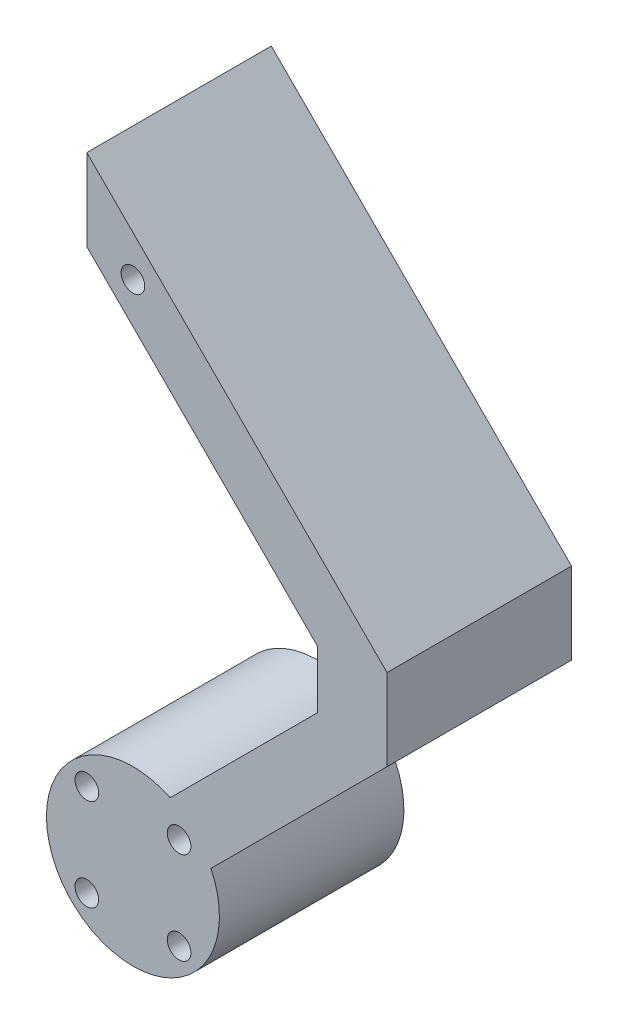
ISO-10303-21;
HEADER;
FILE_DESCRIPTION(('STEP AP214'),'2;1');
FILE_NAME('part.step','',(''),(''),'','','');
FILE_SCHEMA(('AUTOMOTIVE_DESIGN { 1 0 10303 214 1 1 1 1 }'));
ENDSEC;
DATA;
#1=APPLICATION_CONTEXT('core data for automotive mechanical design processes');
#2=APPLICATION_PROTOCOL_DEFINITION('international standard','automotive_design',2000,#1);
#3=PRODUCT_CONTEXT('',#1,'mechanical');
#4=PRODUCT('Part','Part','',(#3));
#5=PRODUCT_RELATED_PRODUCT_CATEGORY('part','',(#4));
#6=PRODUCT_DEFINITION_FORMATION('','',#4);
#7=PRODUCT_DEFINITION_CONTEXT('part definition',#1,'design');
#8=PRODUCT_DEFINITION('design','',#6,#7);
#9=PRODUCT_DEFINITION_SHAPE('','',#8);
#10=(LENGTH_UNIT() NAMED_UNIT(*) SI_UNIT(.MILLI.,.METRE.));
#11=(NAMED_UNIT(*) PLANE_ANGLE_UNIT() SI_UNIT($,.RADIAN.));
#12=(NAMED_UNIT(*) SI_UNIT($,.STERADIAN.) SOLID_ANGLE_UNIT());
#13=UNCERTAINTY_MEASURE_WITH_UNIT(LENGTH_MEASURE(1.E-05),#10,'distance_accuracy_value','');
#14=(GEOMETRIC_REPRESENTATION_CONTEXT(3) GLOBAL_UNCERTAINTY_ASSIGNED_CONTEXT((#13)) GLOBAL_UNIT_ASSIGNED_CONTEXT((#10,
#11,#12)) REPRESENTATION_CONTEXT('',''));
#15=CARTESIAN_POINT('',(0.,0.,0.));
#16=DIRECTION('',(0.,0.,1.));
#17=DIRECTION('',(1.,0.,0.));
#18=AXIS2_PLACEMENT_3D('',#15,#16,#17);
#19=CARTESIAN_POINT('',(22.5000000000002,-22.5,32.));
#20=DIRECTION('',(0.70710678118655,-0.707106781186545,0.));
#21=DIRECTION('',(0.707106781186545,0.70710678118655,0.));
#22=AXIS2_PLACEMENT_3D('',#19,#20,#21);
#23=PLANE('',#22);
#24=DIRECTION('',(-0.707106781186545,-0.70710678118655,0.));
#25=VECTOR('',#24,1.);
#26=CARTESIAN_POINT('',(22.5000000000002,-22.5,0.));
#27=LINE('',#26,#25);
#28=CARTESIAN_POINT('',(40.,-5.,0.));
#29=VERTEX_POINT('',#28);
#30=CARTESIAN_POINT('',(14.4644660940675,-30.5355339059327,0.));
#31=VERTEX_POINT('',#30);
#32=EDGE_CURVE('E146',#29,#31,#27,.T.);
#33=ORIENTED_EDGE('',*,*,#32,.T.);
#34=DIRECTION('',(0.,0.,-1.));
#35=VECTOR('',#34,1.);
#36=CARTESIAN_POINT('',(14.4644660940675,-30.5355339059327,32.));
#37=LINE('',#36,#35);
#38=CARTESIAN_POINT('',(14.4644660940675,-30.5355339059327,32.));
#39=VERTEX_POINT('',#38);
#40=EDGE_CURVE('E11',#39,#31,#37,.T.);
#41=ORIENTED_EDGE('',*,*,#40,.F.);
#42=DIRECTION('',(-0.707106781186545,-0.70710678118655,0.));
#43=VECTOR('',#42,1.);
#44=CARTESIAN_POINT('',(22.5000000000002,-22.5,32.));
#45=LINE('',#44,#43);
#46=CARTESIAN_POINT('',(40.,-5.,32.));
#47=VERTEX_POINT('',#46);
#48=EDGE_CURVE('E189',#47,#39,#45,.T.);
#49=ORIENTED_EDGE('',*,*,#48,.F.);
#50=DIRECTION('',(0.,0.,-1.));
#51=VECTOR('',#50,1.);
#52=CARTESIAN_POINT('',(40.,-5.,32.));
#53=LINE('',#52,#51);
#54=EDGE_CURVE('E127',#47,#29,#53,.T.);
#55=ORIENTED_EDGE('',*,*,#54,.T.);
#56=EDGE_LOOP('',(#33,#41,#49,#55));
#57=FACE_BOUND('',#56,.T.);
#58=ADVANCED_FACE('F33',(#57),#23,.F.);
#59=CARTESIAN_POINT('',(8.,-44.0710678118655,32.));
#60=DIRECTION('',(0.,0.,-1.));
#61=DIRECTION('',(-1.,0.,0.));
#62=AXIS2_PLACEMENT_3D('',#59,#60,#61);
#63=CYLINDRICAL_SURFACE('',#62,15.0000000000002);
#64=CARTESIAN_POINT('',(8.,-44.0710678118655,0.));
#65=DIRECTION('',(0.,0.,1.));
#66=DIRECTION('',(1.,0.,0.));
#67=AXIS2_PLACEMENT_3D('',#64,#65,#66);
#68=CIRCLE('',#67,15.0000000000002);
#69=CARTESIAN_POINT('',(21.535533905933,-37.6066017177982,0.));
#70=VERTEX_POINT('',#69);
#71=EDGE_CURVE('E149',#31,#70,#68,.T.);
#72=ORIENTED_EDGE('',*,*,#71,.T.);
#73=DIRECTION('',(0.,0.,-1.));
#74=VECTOR('',#73,1.);
#75=CARTESIAN_POINT('',(21.535533905933,-37.6066017177982,32.));
#76=LINE('',#75,#74);
#77=CARTESIAN_POINT('',(21.535533905933,-37.6066017177982,32.));
#78=VERTEX_POINT('',#77);
#79=EDGE_CURVE('E42',#78,#70,#76,.T.);
#80=ORIENTED_EDGE('',*,*,#79,.F.);
#81=CARTESIAN_POINT('',(8.,-44.0710678118655,32.));
#82=DIRECTION('',(0.,0.,1.));
#83=DIRECTION('',(1.,0.,0.));
#84=AXIS2_PLACEMENT_3D('',#81,#82,#83);
#85=CIRCLE('',#84,15.0000000000002);
#86=EDGE_CURVE('E93',#39,#78,#85,.T.);
#87=ORIENTED_EDGE('',*,*,#86,.F.);
#88=ORIENTED_EDGE('',*,*,#40,.T.);
#89=EDGE_LOOP('',(#72,#80,#87,#88));
#90=FACE_BOUND('',#89,.T.);
#91=ADVANCED_FACE('F235',(#90),#63,.T.);
#92=CARTESIAN_POINT('',(29.5710678118657,-29.5710678118654,32.));
#93=DIRECTION('',(-0.70710678118655,0.707106781186545,0.));
#94=DIRECTION('',(-0.707106781186545,-0.70710678118655,0.));
#95=AXIS2_PLACEMENT_3D('',#92,#93,#94);
#96=PLANE('',#95);
#97=DIRECTION('',(0.707106781186545,0.70710678118655,0.));
#98=VECTOR('',#97,1.);
#99=CARTESIAN_POINT('',(29.5710678118657,-29.5710678118654,0.));
#100=LINE('',#99,#98);
#101=CARTESIAN_POINT('',(52.0710678118655,-7.07106781186546,0.));
#102=VERTEX_POINT('',#101);
#103=EDGE_CURVE('E151',#70,#102,#100,.T.);
#104=ORIENTED_EDGE('',*,*,#103,.T.);
#105=DIRECTION('',(0.,0.,-1.));
#106=VECTOR('',#105,1.);
#107=CARTESIAN_POINT('',(52.0710678118655,-7.07106781186546,32.));
#108=LINE('',#107,#106);
#109=CARTESIAN_POINT('',(52.0710678118655,-7.07106781186546,32.));
#110=VERTEX_POINT('',#109);
#111=EDGE_CURVE('E168',#110,#102,#108,.T.);
#112=ORIENTED_EDGE('',*,*,#111,.F.);
#113=DIRECTION('',(0.707106781186545,0.70710678118655,0.));
#114=VECTOR('',#113,1.);
#115=CARTESIAN_POINT('',(29.5710678118657,-29.5710678118654,32.));
#116=LINE('',#115,#114);
#117=EDGE_CURVE('E175',#78,#110,#116,.T.);
#118=ORIENTED_EDGE('',*,*,#117,.F.);
#119=ORIENTED_EDGE('',*,*,#79,.T.);
#120=EDGE_LOOP('',(#104,#112,#118,#119));
#121=FACE_BOUND('',#120,.T.);
#122=ADVANCED_FACE('F173',(#121),#96,.F.);
#123=CARTESIAN_POINT('',(52.0710678118655,-1.53293232913166E-13,32.));
#124=DIRECTION('',(1.,0.,0.));
#125=DIRECTION('',(0.,1.,0.));
#126=AXIS2_PLACEMENT_3D('',#123,#124,#125);
#127=PLANE('',#126);
#128=DIRECTION('',(0.,-1.,0.));
#129=VECTOR('',#128,1.);
#130=CARTESIAN_POINT('',(52.0710678118655,-1.53293232913166E-13,0.));
#131=LINE('',#130,#129);
#132=CARTESIAN_POINT('',(52.0710678118655,7.07106781186545,0.));
#133=VERTEX_POINT('',#132);
#134=EDGE_CURVE('E154',#133,#102,#131,.T.);
#135=ORIENTED_EDGE('',*,*,#134,.F.);
#136=DIRECTION('',(0.,0.,-1.));
#137=VECTOR('',#136,1.);
#138=CARTESIAN_POINT('',(52.0710678118655,7.07106781186545,32.));
#139=LINE('',#138,#137);
#140=CARTESIAN_POINT('',(52.0710678118655,7.07106781186545,32.));
#141=VERTEX_POINT('',#140);
#142=EDGE_CURVE('E166',#141,#133,#139,.T.);
#143=ORIENTED_EDGE('',*,*,#142,.F.);
#144=DIRECTION('',(0.,-1.,0.));
#145=VECTOR('',#144,1.);
#146=CARTESIAN_POINT('',(52.0710678118655,-1.53293232913166E-13,32.));
#147=LINE('',#146,#145);
#148=EDGE_CURVE('E184',#141,#110,#147,.T.);
#149=ORIENTED_EDGE('',*,*,#148,.T.);
#150=ORIENTED_EDGE('',*,*,#111,.T.);
#151=EDGE_LOOP('',(#135,#143,#149,#150));
#152=FACE_BOUND('',#151,.T.);
#153=ADVANCED_FACE('F182',(#152),#127,.T.);
#154=CARTESIAN_POINT('',(29.5710678118656,29.5710678118655,32.));
#155=DIRECTION('',(-0.707106781186549,-0.707106781186546,0.));
#156=DIRECTION('',(0.707106781186546,-0.707106781186549,0.));
#157=AXIS2_PLACEMENT_3D('',#154,#155,#156);
#158=PLANE('',#157);
#159=DIRECTION('',(-0.707106781186546,0.707106781186549,0.));
#160=VECTOR('',#159,1.);
#161=CARTESIAN_POINT('',(29.5710678118656,29.5710678118655,0.));
#162=LINE('',#161,#160);
#163=CARTESIAN_POINT('',(0.,59.1421356237311,0.));
#164=VERTEX_POINT('',#163);
#165=EDGE_CURVE('E157',#133,#164,#162,.T.);
#166=ORIENTED_EDGE('',*,*,#165,.T.);
#167=DIRECTION('',(0.,0.,-1.));
#168=VECTOR('',#167,1.);
#169=CARTESIAN_POINT('',(0.,59.1421356237311,32.));
#170=LINE('',#169,#168);
#171=CARTESIAN_POINT('',(0.,59.1421356237311,32.));
#172=VERTEX_POINT('',#171);
#173=EDGE_CURVE('E122',#172,#164,#170,.T.);
#174=ORIENTED_EDGE('',*,*,#173,.F.);
#175=DIRECTION('',(-0.707106781186546,0.707106781186549,0.));
#176=VECTOR('',#175,1.);
#177=CARTESIAN_POINT('',(29.5710678118656,29.5710678118655,32.));
#178=LINE('',#177,#176);
#179=EDGE_CURVE('E113',#141,#172,#178,.T.);
#180=ORIENTED_EDGE('',*,*,#179,.F.);
#181=ORIENTED_EDGE('',*,*,#142,.T.);
#182=EDGE_LOOP('',(#166,#174,#180,#181));
#183=FACE_BOUND('',#182,.T.);
#184=ADVANCED_FACE('F274',(#183),#158,.F.);
#185=CARTESIAN_POINT('',(0.,0.,32.));
#186=DIRECTION('',(1.,0.,0.));
#187=DIRECTION('',(0.,1.,0.));
#188=AXIS2_PLACEMENT_3D('',#185,#186,#187);
#189=PLANE('',#188);
#190=DIRECTION('',(0.,-1.,0.));
#191=VECTOR('',#190,1.);
#192=CARTESIAN_POINT('',(0.,0.,0.));
#193=LINE('',#192,#191);
#194=CARTESIAN_POINT('',(0.,45.0000000000002,0.));
#195=VERTEX_POINT('',#194);
#196=EDGE_CURVE('E121',#164,#195,#193,.T.);
#197=ORIENTED_EDGE('',*,*,#196,.T.);
#198=DIRECTION('',(0.,0.,-1.));
#199=VECTOR('',#198,1.);
#200=CARTESIAN_POINT('',(0.,45.0000000000002,32.));
#201=LINE('',#200,#199);
#202=CARTESIAN_POINT('',(0.,45.0000000000002,32.));
#203=VERTEX_POINT('',#202);
#204=EDGE_CURVE('E118',#203,#195,#201,.T.);
#205=ORIENTED_EDGE('',*,*,#204,.F.);
#206=DIRECTION('',(0.,-1.,0.));
#207=VECTOR('',#206,1.);
#208=CARTESIAN_POINT('',(0.,0.,32.));
#209=LINE('',#208,#207);
#210=EDGE_CURVE('E106',#172,#203,#209,.T.);
#211=ORIENTED_EDGE('',*,*,#210,.F.);
#212=ORIENTED_EDGE('',*,*,#173,.T.);
#213=EDGE_LOOP('',(#197,#205,#211,#212));
#214=FACE_BOUND('',#213,.T.);
#215=ADVANCED_FACE('F119',(#214),#189,.F.);
#216=CARTESIAN_POINT('',(22.5000000000001,22.5,32.));
#217=DIRECTION('',(0.707106781186549,0.707106781186546,0.));
#218=DIRECTION('',(-0.707106781186546,0.707106781186549,0.));
#219=AXIS2_PLACEMENT_3D('',#216,#217,#218);
#220=PLANE('',#219);
#221=DIRECTION('',(0.707106781186546,-0.707106781186549,0.));
#222=VECTOR('',#221,1.);
#223=CARTESIAN_POINT('',(22.5000000000001,22.5,0.));
#224=LINE('',#223,#222);
#225=CARTESIAN_POINT('',(40.,5.,0.));
#226=VERTEX_POINT('',#225);
#227=EDGE_CURVE('E79',#195,#226,#224,.T.);
#228=ORIENTED_EDGE('',*,*,#227,.T.);
#229=DIRECTION('',(0.,0.,-1.));
#230=VECTOR('',#229,1.);
#231=CARTESIAN_POINT('',(40.,5.,32.));
#232=LINE('',#231,#230);
#233=CARTESIAN_POINT('',(40.,5.,32.));
#234=VERTEX_POINT('',#233);
#235=EDGE_CURVE('E123',#234,#226,#232,.T.);
#236=ORIENTED_EDGE('',*,*,#235,.F.);
#237=DIRECTION('',(0.707106781186546,-0.707106781186549,0.));
#238=VECTOR('',#237,1.);
#239=CARTESIAN_POINT('',(22.5000000000001,22.5,32.));
#240=LINE('',#239,#238);
#241=EDGE_CURVE('E110',#203,#234,#240,.T.);
#242=ORIENTED_EDGE('',*,*,#241,.F.);
#243=ORIENTED_EDGE('',*,*,#204,.T.);
#244=EDGE_LOOP('',(#228,#236,#242,#243));
#245=FACE_BOUND('',#244,.T.);
#246=ADVANCED_FACE('F125',(#245),#220,.F.);
#247=CARTESIAN_POINT('',(8.,44.0710678118655,32.));
#248=DIRECTION('',(0.,0.,-1.));
#249=DIRECTION('',(-1.,0.,0.));
#250=AXIS2_PLACEMENT_3D('',#247,#248,#249);
#251=CYLINDRICAL_SURFACE('',#250,2.05000000000001);
#252=CARTESIAN_POINT('',(8.,44.0710678118655,32.));
#253=DIRECTION('',(0.,0.,1.));
#254=DIRECTION('',(1.,0.,0.));
#255=AXIS2_PLACEMENT_3D('',#252,#253,#254);
#256=CIRCLE('',#255,2.05000000000001);
#257=CARTESIAN_POINT('',(10.05,44.0710678118655,32.));
#258=VERTEX_POINT('',#257);
#259=EDGE_CURVE('E191',#258,#258,#256,.T.);
#260=ORIENTED_EDGE('',*,*,#259,.T.);
#261=EDGE_LOOP('',(#260));
#262=FACE_BOUND('',#261,.T.);
#263=CARTESIAN_POINT('',(8.,44.0710678118655,0.));
#264=DIRECTION('',(0.,0.,1.));
#265=DIRECTION('',(1.,0.,0.));
#266=AXIS2_PLACEMENT_3D('',#263,#264,#265);
#267=CIRCLE('',#266,2.05000000000001);
#268=CARTESIAN_POINT('',(10.05,44.0710678118655,0.));
#269=VERTEX_POINT('',#268);
#270=EDGE_CURVE('E143',#269,#269,#267,.T.);
#271=ORIENTED_EDGE('',*,*,#270,.F.);
#272=EDGE_LOOP('',(#271));
#273=FACE_BOUND('',#272,.T.);
#274=ADVANCED_FACE('F220',(#262,#273),#251,.F.);
#275=CARTESIAN_POINT('',(1.6306400674182E-13,-36.0710678118654,32.));
#276=DIRECTION('',(0.,0.,-1.));
#277=DIRECTION('',(-1.,0.,0.));
#278=AXIS2_PLACEMENT_3D('',#275,#276,#277);
#279=CYLINDRICAL_SURFACE('',#278,2.05);
#280=CARTESIAN_POINT('',(1.6306400674182E-13,-36.0710678118654,32.));
#281=DIRECTION('',(0.,0.,1.));
#282=DIRECTION('',(1.,0.,0.));
#283=AXIS2_PLACEMENT_3D('',#280,#281,#282);
#284=CIRCLE('',#283,2.05);
#285=CARTESIAN_POINT('',(2.05000000000016,-36.0710678118654,32.));
#286=VERTEX_POINT('',#285);
#287=EDGE_CURVE('E194',#286,#286,#284,.T.);
#288=ORIENTED_EDGE('',*,*,#287,.T.);
#289=EDGE_LOOP('',(#288));
#290=FACE_BOUND('',#289,.T.);
#291=CARTESIAN_POINT('',(1.6306400674182E-13,-36.0710678118654,0.));
#292=DIRECTION('',(0.,0.,1.));
#293=DIRECTION('',(1.,0.,0.));
#294=AXIS2_PLACEMENT_3D('',#291,#292,#293);
#295=CIRCLE('',#294,2.05);
#296=CARTESIAN_POINT('',(2.05000000000016,-36.0710678118654,0.));
#297=VERTEX_POINT('',#296);
#298=EDGE_CURVE('E140',#297,#297,#295,.T.);
#299=ORIENTED_EDGE('',*,*,#298,.F.);
#300=EDGE_LOOP('',(#299));
#301=FACE_BOUND('',#300,.T.);
#302=ADVANCED_FACE('F223',(#290,#301),#279,.F.);
#303=CARTESIAN_POINT('',(16.0000000000002,-36.0710678118654,32.));
#304=DIRECTION('',(0.,0.,-1.));
#305=DIRECTION('',(-1.,0.,0.));
#306=AXIS2_PLACEMENT_3D('',#303,#304,#305);
#307=CYLINDRICAL_SURFACE('',#306,2.05);
#308=CARTESIAN_POINT('',(16.0000000000002,-36.0710678118654,32.));
#309=DIRECTION('',(0.,0.,1.));
#310=DIRECTION('',(1.,0.,0.));
#311=AXIS2_PLACEMENT_3D('',#308,#309,#310);
#312=CIRCLE('',#311,2.05);
#313=CARTESIAN_POINT('',(18.0500000000002,-36.0710678118654,32.));
#314=VERTEX_POINT('',#313);
#315=EDGE_CURVE('E197',#314,#314,#312,.T.);
#316=ORIENTED_EDGE('',*,*,#315,.T.);
#317=EDGE_LOOP('',(#316));
#318=FACE_BOUND('',#317,.T.);
#319=CARTESIAN_POINT('',(16.0000000000002,-36.0710678118654,0.));
#320=DIRECTION('',(0.,0.,1.));
#321=DIRECTION('',(1.,0.,0.));
#322=AXIS2_PLACEMENT_3D('',#319,#320,#321);
#323=CIRCLE('',#322,2.05);
#324=CARTESIAN_POINT('',(18.0500000000002,-36.0710678118654,0.));
#325=VERTEX_POINT('',#324);
#326=EDGE_CURVE('E137',#325,#325,#323,.T.);
#327=ORIENTED_EDGE('',*,*,#326,.F.);
#328=EDGE_LOOP('',(#327));
#329=FACE_BOUND('',#328,.T.);
#330=ADVANCED_FACE('F246',(#318,#329),#307,.F.);
#331=CARTESIAN_POINT('',(16.0000000000002,-52.0710678118654,32.));
#332=DIRECTION('',(0.,0.,-1.));
#333=DIRECTION('',(-1.,0.,0.));
#334=AXIS2_PLACEMENT_3D('',#331,#332,#333);
#335=CYLINDRICAL_SURFACE('',#334,2.05);
#336=CARTESIAN_POINT('',(16.0000000000002,-52.0710678118654,32.));
#337=DIRECTION('',(0.,0.,1.));
#338=DIRECTION('',(1.,0.,0.));
#339=AXIS2_PLACEMENT_3D('',#336,#337,#338);
#340=CIRCLE('',#339,2.05);
#341=CARTESIAN_POINT('',(18.0500000000002,-52.0710678118654,32.));
#342=VERTEX_POINT('',#341);
#343=EDGE_CURVE('E200',#342,#342,#340,.T.);
#344=ORIENTED_EDGE('',*,*,#343,.T.);
#345=EDGE_LOOP('',(#344));
#346=FACE_BOUND('',#345,.T.);
#347=CARTESIAN_POINT('',(16.0000000000002,-52.0710678118654,0.));
#348=DIRECTION('',(0.,0.,1.));
#349=DIRECTION('',(1.,0.,0.));
#350=AXIS2_PLACEMENT_3D('',#347,#348,#349);
#351=CIRCLE('',#350,2.05);
#352=CARTESIAN_POINT('',(18.0500000000002,-52.0710678118654,0.));
#353=VERTEX_POINT('',#352);
#354=EDGE_CURVE('E134',#353,#353,#351,.T.);
#355=ORIENTED_EDGE('',*,*,#354,.F.);
#356=EDGE_LOOP('',(#355));
#357=FACE_BOUND('',#356,.T.);
#358=ADVANCED_FACE('F249',(#346,#357),#335,.F.);
#359=CARTESIAN_POINT('',(1.99048838627914E-13,-52.0710678118654,32.));
#360=DIRECTION('',(0.,0.,-1.));
#361=DIRECTION('',(-1.,0.,0.));
#362=AXIS2_PLACEMENT_3D('',#359,#360,#361);
#363=CYLINDRICAL_SURFACE('',#362,2.05);
#364=CARTESIAN_POINT('',(1.99048838627914E-13,-52.0710678118654,32.));
#365=DIRECTION('',(0.,0.,1.));
#366=DIRECTION('',(1.,0.,0.));
#367=AXIS2_PLACEMENT_3D('',#364,#365,#366);
#368=CIRCLE('',#367,2.05);
#369=CARTESIAN_POINT('',(2.0500000000002,-52.0710678118654,32.));
#370=VERTEX_POINT('',#369);
#371=EDGE_CURVE('E162',#370,#370,#368,.T.);
#372=ORIENTED_EDGE('',*,*,#371,.T.);
#373=EDGE_LOOP('',(#372));
#374=FACE_BOUND('',#373,.T.);
#375=CARTESIAN_POINT('',(1.99048838627914E-13,-52.0710678118654,0.));
#376=DIRECTION('',(0.,0.,1.));
#377=DIRECTION('',(1.,0.,0.));
#378=AXIS2_PLACEMENT_3D('',#375,#376,#377);
#379=CIRCLE('',#378,2.05);
#380=CARTESIAN_POINT('',(2.0500000000002,-52.0710678118654,0.));
#381=VERTEX_POINT('',#380);
#382=EDGE_CURVE('E131',#381,#381,#379,.T.);
#383=ORIENTED_EDGE('',*,*,#382,.F.);
#384=EDGE_LOOP('',(#383));
#385=FACE_BOUND('',#384,.T.);
#386=ADVANCED_FACE('F35',(#374,#385),#363,.F.);
#387=CARTESIAN_POINT('',(40.,0.,32.));
#388=DIRECTION('',(1.,0.,0.));
#389=DIRECTION('',(0.,0.,-1.));
#390=AXIS2_PLACEMENT_3D('',#387,#388,#389);
#391=PLANE('',#390);
#392=DIRECTION('',(0.,-1.,0.));
#393=VECTOR('',#392,1.);
#394=CARTESIAN_POINT('',(40.,0.,0.));
#395=LINE('',#394,#393);
#396=EDGE_CURVE('E85',#226,#29,#395,.T.);
#397=ORIENTED_EDGE('',*,*,#396,.T.);
#398=ORIENTED_EDGE('',*,*,#54,.F.);
#399=DIRECTION('',(0.,-1.,0.));
#400=VECTOR('',#399,1.);
#401=CARTESIAN_POINT('',(40.,0.,32.));
#402=LINE('',#401,#400);
#403=EDGE_CURVE('E50',#234,#47,#402,.T.);
#404=ORIENTED_EDGE('',*,*,#403,.F.);
#405=ORIENTED_EDGE('',*,*,#235,.T.);
#406=EDGE_LOOP('',(#397,#398,#404,#405));
#407=FACE_BOUND('',#406,.T.);
#408=ADVANCED_FACE('F210',(#407),#391,.F.);
#409=CARTESIAN_POINT('',(0.,0.,32.));
#410=DIRECTION('',(0.,0.,1.));
#411=DIRECTION('',(1.,0.,0.));
#412=AXIS2_PLACEMENT_3D('',#409,#410,#411);
#413=PLANE('',#412);
#414=ORIENTED_EDGE('',*,*,#371,.F.);
#415=EDGE_LOOP('',(#414));
#416=FACE_BOUND('',#415,.T.);
#417=ORIENTED_EDGE('',*,*,#343,.F.);
#418=EDGE_LOOP('',(#417));
#419=FACE_BOUND('',#418,.T.);
#420=ORIENTED_EDGE('',*,*,#315,.F.);
#421=EDGE_LOOP('',(#420));
#422=FACE_BOUND('',#421,.T.);
#423=ORIENTED_EDGE('',*,*,#287,.F.);
#424=EDGE_LOOP('',(#423));
#425=FACE_BOUND('',#424,.T.);
#426=ORIENTED_EDGE('',*,*,#259,.F.);
#427=EDGE_LOOP('',(#426));
#428=FACE_BOUND('',#427,.T.);
#429=ORIENTED_EDGE('',*,*,#48,.T.);
#430=ORIENTED_EDGE('',*,*,#86,.T.);
#431=ORIENTED_EDGE('',*,*,#117,.T.);
#432=ORIENTED_EDGE('',*,*,#148,.F.);
#433=ORIENTED_EDGE('',*,*,#179,.T.);
#434=ORIENTED_EDGE('',*,*,#210,.T.);
#435=ORIENTED_EDGE('',*,*,#241,.T.);
#436=ORIENTED_EDGE('',*,*,#403,.T.);
#437=EDGE_LOOP('',(#429,#430,#431,#432,#433,#434,#435,#436));
#438=FACE_BOUND('',#437,.T.);
#439=ADVANCED_FACE('F108',(#416,#419,#422,#425,#428,#438),#413,.T.);
#440=CARTESIAN_POINT('',(0.,0.,0.));
#441=DIRECTION('',(0.,0.,1.));
#442=DIRECTION('',(1.,0.,0.));
#443=AXIS2_PLACEMENT_3D('',#440,#441,#442);
#444=PLANE('',#443);
#445=ORIENTED_EDGE('',*,*,#382,.T.);
#446=EDGE_LOOP('',(#445));
#447=FACE_BOUND('',#446,.T.);
#448=ORIENTED_EDGE('',*,*,#354,.T.);
#449=EDGE_LOOP('',(#448));
#450=FACE_BOUND('',#449,.T.);
#451=ORIENTED_EDGE('',*,*,#326,.T.);
#452=EDGE_LOOP('',(#451));
#453=FACE_BOUND('',#452,.T.);
#454=ORIENTED_EDGE('',*,*,#298,.T.);
#455=EDGE_LOOP('',(#454));
#456=FACE_BOUND('',#455,.T.);
#457=ORIENTED_EDGE('',*,*,#270,.T.);
#458=EDGE_LOOP('',(#457));
#459=FACE_BOUND('',#458,.T.);
#460=ORIENTED_EDGE('',*,*,#32,.F.);
#461=ORIENTED_EDGE('',*,*,#396,.F.);
#462=ORIENTED_EDGE('',*,*,#227,.F.);
#463=ORIENTED_EDGE('',*,*,#196,.F.);
#464=ORIENTED_EDGE('',*,*,#165,.F.);
#465=ORIENTED_EDGE('',*,*,#134,.T.);
#466=ORIENTED_EDGE('',*,*,#103,.F.);
#467=ORIENTED_EDGE('',*,*,#71,.F.);
#468=EDGE_LOOP('',(#460,#461,#462,#463,#464,#465,#466,#467));
#469=FACE_BOUND('',#468,.T.);
#470=ADVANCED_FACE('F178',(#447,#450,#453,#456,#459,#469),#444,.F.);
#471=CLOSED_SHELL('',(#58,#91,#122,#153,#184,#215,#246,#274,#302,#330,#358,#386,#408,#439,#470));
#472=MANIFOLD_SOLID_BREP('B2',#471);
#473=ADVANCED_BREP_SHAPE_REPRESENTATION('',(#18,#472),#14);
#474=SHAPE_DEFINITION_REPRESENTATION(#9,#473);
ENDSEC;
END-ISO-10303-21;
